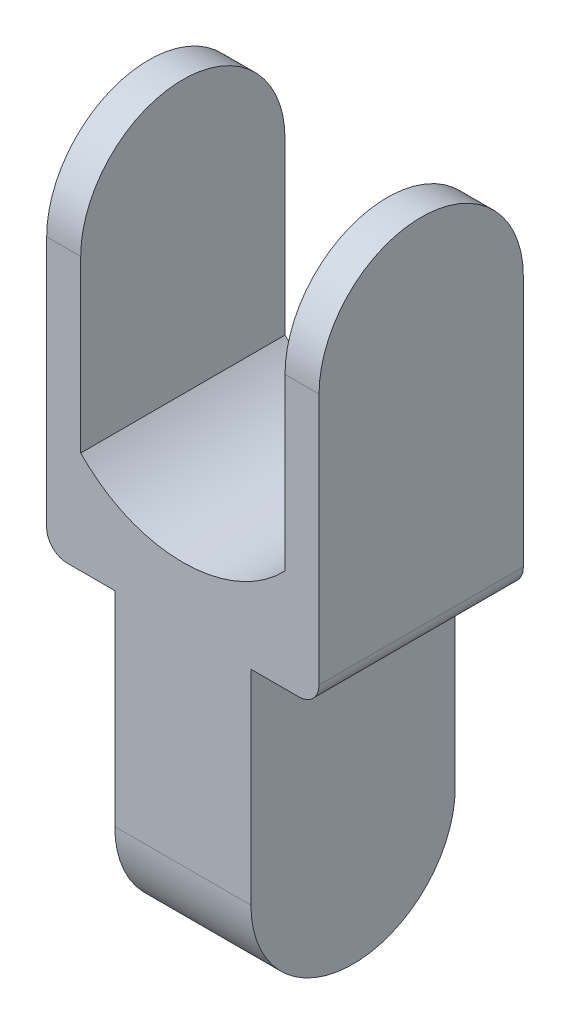
ISO-10303-21;
HEADER;
FILE_DESCRIPTION(('STEP AP214'),'2;1');
FILE_NAME('part.step','',(''),(''),'','','');
FILE_SCHEMA(('AUTOMOTIVE_DESIGN { 1 0 10303 214 1 1 1 1 }'));
ENDSEC;
DATA;
#1=APPLICATION_CONTEXT('core data for automotive mechanical design processes');
#2=APPLICATION_PROTOCOL_DEFINITION('international standard','automotive_design',2000,#1);
#3=PRODUCT_CONTEXT('',#1,'mechanical');
#4=PRODUCT('Part','Part','',(#3));
#5=PRODUCT_RELATED_PRODUCT_CATEGORY('part','',(#4));
#6=PRODUCT_DEFINITION_FORMATION('','',#4);
#7=PRODUCT_DEFINITION_CONTEXT('part definition',#1,'design');
#8=PRODUCT_DEFINITION('design','',#6,#7);
#9=PRODUCT_DEFINITION_SHAPE('','',#8);
#10=(LENGTH_UNIT() NAMED_UNIT(*) SI_UNIT(.MILLI.,.METRE.));
#11=(NAMED_UNIT(*) PLANE_ANGLE_UNIT() SI_UNIT($,.RADIAN.));
#12=(NAMED_UNIT(*) SI_UNIT($,.STERADIAN.) SOLID_ANGLE_UNIT());
#13=UNCERTAINTY_MEASURE_WITH_UNIT(LENGTH_MEASURE(1.E-05),#10,'distance_accuracy_value','');
#14=(GEOMETRIC_REPRESENTATION_CONTEXT(3) GLOBAL_UNCERTAINTY_ASSIGNED_CONTEXT((#13)) GLOBAL_UNIT_ASSIGNED_CONTEXT((#10,
#11,#12)) REPRESENTATION_CONTEXT('',''));
#15=CARTESIAN_POINT('',(0.,0.,0.));
#16=DIRECTION('',(0.,0.,1.));
#17=DIRECTION('',(1.,0.,0.));
#18=AXIS2_PLACEMENT_3D('',#15,#16,#17);
#19=CARTESIAN_POINT('',(-100.,300.,-150.));
#20=DIRECTION('',(0.,0.,-1.));
#21=DIRECTION('',(-1.,0.,0.));
#22=AXIS2_PLACEMENT_3D('',#19,#20,#21);
#23=PLANE('',#22);
#24=CARTESIAN_POINT('',(0.,593.524340848912,-150.));
#25=DIRECTION('',(0.,0.,-1.));
#26=DIRECTION('',(-1.,0.,0.));
#27=AXIS2_PLACEMENT_3D('',#24,#25,#26);
#28=CIRCLE('',#27,207.603555885044);
#29=CARTESIAN_POINT('',(150.,450.,-150.));
#30=VERTEX_POINT('',#29);
#31=CARTESIAN_POINT('',(-150.,450.,-150.));
#32=VERTEX_POINT('',#31);
#33=EDGE_CURVE('E136',#30,#32,#28,.T.);
#34=ORIENTED_EDGE('',*,*,#33,.F.);
#35=DIRECTION('',(0.,1.,0.));
#36=VECTOR('',#35,1.);
#37=CARTESIAN_POINT('',(150.,300.,-150.));
#38=LINE('',#37,#36);
#39=CARTESIAN_POINT('',(150.,700.,-150.));
#40=VERTEX_POINT('',#39);
#41=EDGE_CURVE('E149',#30,#40,#38,.T.);
#42=ORIENTED_EDGE('',*,*,#41,.T.);
#43=DIRECTION('',(1.,0.,0.));
#44=VECTOR('',#43,1.);
#45=CARTESIAN_POINT('',(0.,700.,-150.));
#46=LINE('',#45,#44);
#47=CARTESIAN_POINT('',(200.,700.,-150.));
#48=VERTEX_POINT('',#47);
#49=EDGE_CURVE('E188',#40,#48,#46,.T.);
#50=ORIENTED_EDGE('',*,*,#49,.T.);
#51=DIRECTION('',(0.,1.,0.));
#52=VECTOR('',#51,1.);
#53=CARTESIAN_POINT('',(200.,0.,-150.));
#54=LINE('',#53,#52);
#55=CARTESIAN_POINT('',(200.,330.,-150.));
#56=VERTEX_POINT('',#55);
#57=EDGE_CURVE('E186',#56,#48,#54,.T.);
#58=ORIENTED_EDGE('',*,*,#57,.F.);
#59=CARTESIAN_POINT('',(170.,330.,-150.));
#60=DIRECTION('',(0.,0.,-1.));
#61=DIRECTION('',(-1.,0.,0.));
#62=AXIS2_PLACEMENT_3D('',#59,#60,#61);
#63=CIRCLE('',#62,30.);
#64=CARTESIAN_POINT('',(170.,300.,-150.));
#65=VERTEX_POINT('',#64);
#66=EDGE_CURVE('E57',#56,#65,#63,.T.);
#67=ORIENTED_EDGE('',*,*,#66,.T.);
#68=DIRECTION('',(-1.,0.,0.));
#69=VECTOR('',#68,1.);
#70=CARTESIAN_POINT('',(0.,300.,-150.));
#71=LINE('',#70,#69);
#72=CARTESIAN_POINT('',(100.,300.,-150.));
#73=VERTEX_POINT('',#72);
#74=EDGE_CURVE('E184',#65,#73,#71,.T.);
#75=ORIENTED_EDGE('',*,*,#74,.T.);
#76=DIRECTION('',(0.,-1.,0.));
#77=VECTOR('',#76,1.);
#78=CARTESIAN_POINT('',(99.9999999999999,300.,-150.));
#79=LINE('',#78,#77);
#80=CARTESIAN_POINT('',(100.,0.,-150.));
#81=VERTEX_POINT('',#80);
#82=EDGE_CURVE('E196',#73,#81,#79,.T.);
#83=ORIENTED_EDGE('',*,*,#82,.T.);
#84=DIRECTION('',(1.,0.,0.));
#85=VECTOR('',#84,1.);
#86=CARTESIAN_POINT('',(-100.,0.,-150.));
#87=LINE('',#86,#85);
#88=CARTESIAN_POINT('',(-100.,0.,-150.));
#89=VERTEX_POINT('',#88);
#90=EDGE_CURVE('E181',#89,#81,#87,.T.);
#91=ORIENTED_EDGE('',*,*,#90,.F.);
#92=DIRECTION('',(0.,-1.,0.));
#93=VECTOR('',#92,1.);
#94=CARTESIAN_POINT('',(-100.,300.,-150.));
#95=LINE('',#94,#93);
#96=CARTESIAN_POINT('',(-100.,300.,-150.));
#97=VERTEX_POINT('',#96);
#98=EDGE_CURVE('E201',#97,#89,#95,.T.);
#99=ORIENTED_EDGE('',*,*,#98,.F.);
#100=CARTESIAN_POINT('',(-170.,300.,-150.));
#101=VERTEX_POINT('',#100);
#102=EDGE_CURVE('E183',#97,#101,#71,.T.);
#103=ORIENTED_EDGE('',*,*,#102,.T.);
#104=CARTESIAN_POINT('',(-170.,330.,-150.));
#105=DIRECTION('',(0.,0.,-1.));
#106=DIRECTION('',(-1.,0.,0.));
#107=AXIS2_PLACEMENT_3D('',#104,#105,#106);
#108=CIRCLE('',#107,30.);
#109=CARTESIAN_POINT('',(-200.,330.,-150.));
#110=VERTEX_POINT('',#109);
#111=EDGE_CURVE('E221',#101,#110,#108,.T.);
#112=ORIENTED_EDGE('',*,*,#111,.T.);
#113=DIRECTION('',(0.,1.,0.));
#114=VECTOR('',#113,1.);
#115=CARTESIAN_POINT('',(-200.,0.,-150.));
#116=LINE('',#115,#114);
#117=CARTESIAN_POINT('',(-200.,700.,-150.));
#118=VERTEX_POINT('',#117);
#119=EDGE_CURVE('E167',#110,#118,#116,.T.);
#120=ORIENTED_EDGE('',*,*,#119,.T.);
#121=CARTESIAN_POINT('',(-150.,700.,-150.));
#122=VERTEX_POINT('',#121);
#123=EDGE_CURVE('E172',#118,#122,#46,.T.);
#124=ORIENTED_EDGE('',*,*,#123,.T.);
#125=DIRECTION('',(0.,1.,0.));
#126=VECTOR('',#125,1.);
#127=CARTESIAN_POINT('',(-150.,300.,-150.));
#128=LINE('',#127,#126);
#129=EDGE_CURVE('E152',#32,#122,#128,.T.);
#130=ORIENTED_EDGE('',*,*,#129,.F.);
#131=EDGE_LOOP('',(#34,#42,#50,#58,#67,#75,#83,#91,#99,#103,#112,#120,#124,#130));
#132=FACE_BOUND('',#131,.T.);
#133=ADVANCED_FACE('F35',(#132),#23,.T.);
#134=CARTESIAN_POINT('',(-100.,300.,150.));
#135=DIRECTION('',(0.,0.,-1.));
#136=DIRECTION('',(-1.,0.,0.));
#137=AXIS2_PLACEMENT_3D('',#134,#135,#136);
#138=PLANE('',#137);
#139=DIRECTION('',(0.,1.,0.));
#140=VECTOR('',#139,1.);
#141=CARTESIAN_POINT('',(150.,300.,150.));
#142=LINE('',#141,#140);
#143=CARTESIAN_POINT('',(150.,450.,150.));
#144=VERTEX_POINT('',#143);
#145=CARTESIAN_POINT('',(150.,700.,150.));
#146=VERTEX_POINT('',#145);
#147=EDGE_CURVE('E158',#144,#146,#142,.T.);
#148=ORIENTED_EDGE('',*,*,#147,.F.);
#149=CARTESIAN_POINT('',(0.,593.524340848912,150.));
#150=DIRECTION('',(0.,0.,-1.));
#151=DIRECTION('',(-1.,0.,0.));
#152=AXIS2_PLACEMENT_3D('',#149,#150,#151);
#153=CIRCLE('',#152,207.603555885044);
#154=CARTESIAN_POINT('',(-150.,450.,150.));
#155=VERTEX_POINT('',#154);
#156=EDGE_CURVE('E139',#144,#155,#153,.T.);
#157=ORIENTED_EDGE('',*,*,#156,.T.);
#158=DIRECTION('',(0.,1.,0.));
#159=VECTOR('',#158,1.);
#160=CARTESIAN_POINT('',(-150.,300.,150.));
#161=LINE('',#160,#159);
#162=CARTESIAN_POINT('',(-150.,700.,150.));
#163=VERTEX_POINT('',#162);
#164=EDGE_CURVE('E143',#155,#163,#161,.T.);
#165=ORIENTED_EDGE('',*,*,#164,.T.);
#166=DIRECTION('',(1.,0.,0.));
#167=VECTOR('',#166,1.);
#168=CARTESIAN_POINT('',(0.,700.,150.));
#169=LINE('',#168,#167);
#170=CARTESIAN_POINT('',(-200.,700.,150.));
#171=VERTEX_POINT('',#170);
#172=EDGE_CURVE('E178',#171,#163,#169,.T.);
#173=ORIENTED_EDGE('',*,*,#172,.F.);
#174=DIRECTION('',(0.,1.,0.));
#175=VECTOR('',#174,1.);
#176=CARTESIAN_POINT('',(-200.,0.,150.));
#177=LINE('',#176,#175);
#178=CARTESIAN_POINT('',(-200.,330.,150.));
#179=VERTEX_POINT('',#178);
#180=EDGE_CURVE('E169',#179,#171,#177,.T.);
#181=ORIENTED_EDGE('',*,*,#180,.F.);
#182=CARTESIAN_POINT('',(-170.,330.,150.));
#183=DIRECTION('',(0.,0.,-1.));
#184=DIRECTION('',(-1.,0.,0.));
#185=AXIS2_PLACEMENT_3D('',#182,#183,#184);
#186=CIRCLE('',#185,30.);
#187=CARTESIAN_POINT('',(-170.,300.,150.));
#188=VERTEX_POINT('',#187);
#189=EDGE_CURVE('E225',#179,#188,#186,.F.);
#190=ORIENTED_EDGE('',*,*,#189,.T.);
#191=DIRECTION('',(-1.,0.,0.));
#192=VECTOR('',#191,1.);
#193=CARTESIAN_POINT('',(0.,300.,150.));
#194=LINE('',#193,#192);
#195=CARTESIAN_POINT('',(-100.,300.,150.));
#196=VERTEX_POINT('',#195);
#197=EDGE_CURVE('E171',#196,#188,#194,.T.);
#198=ORIENTED_EDGE('',*,*,#197,.F.);
#199=DIRECTION('',(0.,-1.,0.));
#200=VECTOR('',#199,1.);
#201=CARTESIAN_POINT('',(-100.,300.,150.));
#202=LINE('',#201,#200);
#203=CARTESIAN_POINT('',(-100.,0.,150.));
#204=VERTEX_POINT('',#203);
#205=EDGE_CURVE('E204',#196,#204,#202,.T.);
#206=ORIENTED_EDGE('',*,*,#205,.T.);
#207=DIRECTION('',(1.,0.,0.));
#208=VECTOR('',#207,1.);
#209=CARTESIAN_POINT('',(-100.,0.,150.));
#210=LINE('',#209,#208);
#211=CARTESIAN_POINT('',(100.,0.,150.));
#212=VERTEX_POINT('',#211);
#213=EDGE_CURVE('E194',#204,#212,#210,.T.);
#214=ORIENTED_EDGE('',*,*,#213,.T.);
#215=DIRECTION('',(0.,-1.,0.));
#216=VECTOR('',#215,1.);
#217=CARTESIAN_POINT('',(100.,300.,150.));
#218=LINE('',#217,#216);
#219=CARTESIAN_POINT('',(100.,300.,150.));
#220=VERTEX_POINT('',#219);
#221=EDGE_CURVE('E206',#220,#212,#218,.T.);
#222=ORIENTED_EDGE('',*,*,#221,.F.);
#223=CARTESIAN_POINT('',(170.,300.,150.));
#224=VERTEX_POINT('',#223);
#225=EDGE_CURVE('E173',#224,#220,#194,.T.);
#226=ORIENTED_EDGE('',*,*,#225,.F.);
#227=CARTESIAN_POINT('',(170.,330.,150.));
#228=DIRECTION('',(0.,0.,-1.));
#229=DIRECTION('',(-1.,0.,0.));
#230=AXIS2_PLACEMENT_3D('',#227,#228,#229);
#231=CIRCLE('',#230,30.);
#232=CARTESIAN_POINT('',(200.,330.,150.));
#233=VERTEX_POINT('',#232);
#234=EDGE_CURVE('E11',#224,#233,#231,.F.);
#235=ORIENTED_EDGE('',*,*,#234,.T.);
#236=DIRECTION('',(0.,1.,0.));
#237=VECTOR('',#236,1.);
#238=CARTESIAN_POINT('',(200.,0.,150.));
#239=LINE('',#238,#237);
#240=CARTESIAN_POINT('',(200.,700.,150.));
#241=VERTEX_POINT('',#240);
#242=EDGE_CURVE('E175',#233,#241,#239,.T.);
#243=ORIENTED_EDGE('',*,*,#242,.T.);
#244=EDGE_CURVE('E177',#146,#241,#169,.T.);
#245=ORIENTED_EDGE('',*,*,#244,.F.);
#246=EDGE_LOOP('',(#148,#157,#165,#173,#181,#190,#198,#206,#214,#222,#226,#235,#243,#245));
#247=FACE_BOUND('',#246,.T.);
#248=ADVANCED_FACE('F242',(#247),#138,.F.);
#249=CARTESIAN_POINT('',(200.,700.,0.));
#250=DIRECTION('',(-1.,0.,0.));
#251=DIRECTION('',(0.,0.,1.));
#252=AXIS2_PLACEMENT_3D('',#249,#250,#251);
#253=CYLINDRICAL_SURFACE('',#252,150.);
#254=CARTESIAN_POINT('',(150.,700.,0.));
#255=DIRECTION('',(-1.,0.,0.));
#256=DIRECTION('',(0.,-1.,0.));
#257=AXIS2_PLACEMENT_3D('',#254,#255,#256);
#258=CIRCLE('',#257,150.);
#259=EDGE_CURVE('E156',#146,#40,#258,.T.);
#260=ORIENTED_EDGE('',*,*,#259,.F.);
#261=ORIENTED_EDGE('',*,*,#244,.T.);
#262=CARTESIAN_POINT('',(200.,700.,0.));
#263=DIRECTION('',(1.,0.,0.));
#264=DIRECTION('',(0.,0.,-1.));
#265=AXIS2_PLACEMENT_3D('',#262,#263,#264);
#266=CIRCLE('',#265,150.);
#267=EDGE_CURVE('E161',#48,#241,#266,.T.);
#268=ORIENTED_EDGE('',*,*,#267,.F.);
#269=ORIENTED_EDGE('',*,*,#49,.F.);
#270=EDGE_LOOP('',(#260,#261,#268,#269));
#271=FACE_BOUND('',#270,.T.);
#272=ADVANCED_FACE('F239',(#271),#253,.T.);
#273=CARTESIAN_POINT('',(100.,0.,0.));
#274=DIRECTION('',(-1.,0.,0.));
#275=DIRECTION('',(0.,0.,1.));
#276=AXIS2_PLACEMENT_3D('',#273,#274,#275);
#277=CYLINDRICAL_SURFACE('',#276,150.);
#278=CARTESIAN_POINT('',(100.,0.,0.));
#279=DIRECTION('',(1.,0.,0.));
#280=DIRECTION('',(0.,0.,-1.));
#281=AXIS2_PLACEMENT_3D('',#278,#279,#280);
#282=CIRCLE('',#281,150.);
#283=EDGE_CURVE('E209',#212,#81,#282,.T.);
#284=ORIENTED_EDGE('',*,*,#283,.F.);
#285=ORIENTED_EDGE('',*,*,#213,.F.);
#286=CARTESIAN_POINT('',(-100.,0.,0.));
#287=DIRECTION('',(1.,0.,0.));
#288=DIRECTION('',(0.,0.,-1.));
#289=AXIS2_PLACEMENT_3D('',#286,#287,#288);
#290=CIRCLE('',#289,150.);
#291=EDGE_CURVE('E203',#204,#89,#290,.T.);
#292=ORIENTED_EDGE('',*,*,#291,.T.);
#293=ORIENTED_EDGE('',*,*,#90,.T.);
#294=EDGE_LOOP('',(#284,#285,#292,#293));
#295=FACE_BOUND('',#294,.T.);
#296=ADVANCED_FACE('F265',(#295),#277,.T.);
#297=CARTESIAN_POINT('',(100.,0.,0.));
#298=DIRECTION('',(1.,0.,0.));
#299=DIRECTION('',(0.,0.,-1.));
#300=AXIS2_PLACEMENT_3D('',#297,#298,#299);
#301=PLANE('',#300);
#302=ORIENTED_EDGE('',*,*,#283,.T.);
#303=ORIENTED_EDGE('',*,*,#82,.F.);
#304=DIRECTION('',(0.,0.,1.));
#305=VECTOR('',#304,1.);
#306=CARTESIAN_POINT('',(99.9999999999999,300.,-150.));
#307=LINE('',#306,#305);
#308=EDGE_CURVE('E190',#73,#220,#307,.T.);
#309=ORIENTED_EDGE('',*,*,#308,.T.);
#310=ORIENTED_EDGE('',*,*,#221,.T.);
#311=EDGE_LOOP('',(#302,#303,#309,#310));
#312=FACE_BOUND('',#311,.T.);
#313=ADVANCED_FACE('F261',(#312),#301,.T.);
#314=CARTESIAN_POINT('',(-100.,0.,0.));
#315=DIRECTION('',(1.,0.,0.));
#316=DIRECTION('',(0.,0.,-1.));
#317=AXIS2_PLACEMENT_3D('',#314,#315,#316);
#318=PLANE('',#317);
#319=ORIENTED_EDGE('',*,*,#291,.F.);
#320=ORIENTED_EDGE('',*,*,#205,.F.);
#321=DIRECTION('',(0.,0.,1.));
#322=VECTOR('',#321,1.);
#323=CARTESIAN_POINT('',(-100.,300.,-150.));
#324=LINE('',#323,#322);
#325=EDGE_CURVE('E193',#97,#196,#324,.T.);
#326=ORIENTED_EDGE('',*,*,#325,.F.);
#327=ORIENTED_EDGE('',*,*,#98,.T.);
#328=EDGE_LOOP('',(#319,#320,#326,#327));
#329=FACE_BOUND('',#328,.T.);
#330=ADVANCED_FACE('F264',(#329),#318,.F.);
#331=CARTESIAN_POINT('',(0.,300.,150.));
#332=DIRECTION('',(0.,-1.,0.));
#333=DIRECTION('',(1.,0.,0.));
#334=AXIS2_PLACEMENT_3D('',#331,#332,#333);
#335=PLANE('',#334);
#336=ORIENTED_EDGE('',*,*,#74,.F.);
#337=DIRECTION('',(0.,0.,-1.));
#338=VECTOR('',#337,1.);
#339=CARTESIAN_POINT('',(170.,300.,150.));
#340=LINE('',#339,#338);
#341=EDGE_CURVE('E43',#65,#224,#340,.F.);
#342=ORIENTED_EDGE('',*,*,#341,.T.);
#343=ORIENTED_EDGE('',*,*,#225,.T.);
#344=ORIENTED_EDGE('',*,*,#308,.F.);
#345=EDGE_LOOP('',(#336,#342,#343,#344));
#346=FACE_BOUND('',#345,.T.);
#347=ADVANCED_FACE('F269',(#346),#335,.T.);
#348=CARTESIAN_POINT('',(-200.,0.,150.));
#349=DIRECTION('',(-1.,0.,0.));
#350=DIRECTION('',(0.,0.,1.));
#351=AXIS2_PLACEMENT_3D('',#348,#349,#350);
#352=PLANE('',#351);
#353=ORIENTED_EDGE('',*,*,#119,.F.);
#354=DIRECTION('',(0.,0.,-1.));
#355=VECTOR('',#354,1.);
#356=CARTESIAN_POINT('',(-200.,330.,150.));
#357=LINE('',#356,#355);
#358=EDGE_CURVE('E223',#110,#179,#357,.F.);
#359=ORIENTED_EDGE('',*,*,#358,.T.);
#360=ORIENTED_EDGE('',*,*,#180,.T.);
#361=CARTESIAN_POINT('',(-200.,700.,0.));
#362=DIRECTION('',(1.,0.,0.));
#363=DIRECTION('',(0.,0.,-1.));
#364=AXIS2_PLACEMENT_3D('',#361,#362,#363);
#365=CIRCLE('',#364,150.);
#366=EDGE_CURVE('E157',#118,#171,#365,.T.);
#367=ORIENTED_EDGE('',*,*,#366,.F.);
#368=EDGE_LOOP('',(#353,#359,#360,#367));
#369=FACE_BOUND('',#368,.T.);
#370=ADVANCED_FACE('F291',(#369),#352,.T.);
#371=ORIENTED_EDGE('',*,*,#197,.T.);
#372=DIRECTION('',(0.,0.,-1.));
#373=VECTOR('',#372,1.);
#374=CARTESIAN_POINT('',(-170.,300.,150.));
#375=LINE('',#374,#373);
#376=EDGE_CURVE('E218',#188,#101,#375,.T.);
#377=ORIENTED_EDGE('',*,*,#376,.T.);
#378=ORIENTED_EDGE('',*,*,#102,.F.);
#379=ORIENTED_EDGE('',*,*,#325,.T.);
#380=EDGE_LOOP('',(#371,#377,#378,#379));
#381=FACE_BOUND('',#380,.T.);
#382=ADVANCED_FACE('F293',(#381),#335,.T.);
#383=CARTESIAN_POINT('',(200.,0.,150.));
#384=DIRECTION('',(-1.,0.,0.));
#385=DIRECTION('',(0.,0.,1.));
#386=AXIS2_PLACEMENT_3D('',#383,#384,#385);
#387=PLANE('',#386);
#388=ORIENTED_EDGE('',*,*,#242,.F.);
#389=DIRECTION('',(0.,0.,-1.));
#390=VECTOR('',#389,1.);
#391=CARTESIAN_POINT('',(200.,330.,-150.));
#392=LINE('',#391,#390);
#393=EDGE_CURVE('E227',#233,#56,#392,.T.);
#394=ORIENTED_EDGE('',*,*,#393,.T.);
#395=ORIENTED_EDGE('',*,*,#57,.T.);
#396=ORIENTED_EDGE('',*,*,#267,.T.);
#397=EDGE_LOOP('',(#388,#394,#395,#396));
#398=FACE_BOUND('',#397,.T.);
#399=ADVANCED_FACE('F233',(#398),#387,.F.);
#400=ORIENTED_EDGE('',*,*,#172,.T.);
#401=CARTESIAN_POINT('',(-150.,700.,0.));
#402=DIRECTION('',(-1.,0.,0.));
#403=DIRECTION('',(0.,-1.,0.));
#404=AXIS2_PLACEMENT_3D('',#401,#402,#403);
#405=CIRCLE('',#404,150.);
#406=EDGE_CURVE('E212',#163,#122,#405,.T.);
#407=ORIENTED_EDGE('',*,*,#406,.T.);
#408=ORIENTED_EDGE('',*,*,#123,.F.);
#409=ORIENTED_EDGE('',*,*,#366,.T.);
#410=EDGE_LOOP('',(#400,#407,#408,#409));
#411=FACE_BOUND('',#410,.T.);
#412=ADVANCED_FACE('F277',(#411),#253,.T.);
#413=CARTESIAN_POINT('',(150.,1250.,-200.));
#414=DIRECTION('',(-1.,0.,0.));
#415=DIRECTION('',(0.,-1.,0.));
#416=AXIS2_PLACEMENT_3D('',#413,#414,#415);
#417=PLANE('',#416);
#418=DIRECTION('',(0.,0.,1.));
#419=VECTOR('',#418,1.);
#420=CARTESIAN_POINT('',(150.,450.,-200.));
#421=LINE('',#420,#419);
#422=EDGE_CURVE('E133',#30,#144,#421,.T.);
#423=ORIENTED_EDGE('',*,*,#422,.T.);
#424=ORIENTED_EDGE('',*,*,#147,.T.);
#425=ORIENTED_EDGE('',*,*,#259,.T.);
#426=ORIENTED_EDGE('',*,*,#41,.F.);
#427=EDGE_LOOP('',(#423,#424,#425,#426));
#428=FACE_BOUND('',#427,.T.);
#429=ADVANCED_FACE('F154',(#428),#417,.T.);
#430=CARTESIAN_POINT('',(-150.,1250.,-200.));
#431=DIRECTION('',(-1.,0.,0.));
#432=DIRECTION('',(0.,-1.,0.));
#433=AXIS2_PLACEMENT_3D('',#430,#431,#432);
#434=PLANE('',#433);
#435=ORIENTED_EDGE('',*,*,#129,.T.);
#436=ORIENTED_EDGE('',*,*,#406,.F.);
#437=ORIENTED_EDGE('',*,*,#164,.F.);
#438=DIRECTION('',(0.,0.,1.));
#439=VECTOR('',#438,1.);
#440=CARTESIAN_POINT('',(-150.,450.,-200.));
#441=LINE('',#440,#439);
#442=EDGE_CURVE('E144',#32,#155,#441,.T.);
#443=ORIENTED_EDGE('',*,*,#442,.F.);
#444=EDGE_LOOP('',(#435,#436,#437,#443));
#445=FACE_BOUND('',#444,.T.);
#446=ADVANCED_FACE('F251',(#445),#434,.F.);
#447=CARTESIAN_POINT('',(-170.,330.,150.));
#448=DIRECTION('',(0.,0.,-1.));
#449=DIRECTION('',(-1.,0.,0.));
#450=AXIS2_PLACEMENT_3D('',#447,#448,#449);
#451=CYLINDRICAL_SURFACE('',#450,30.);
#452=ORIENTED_EDGE('',*,*,#189,.F.);
#453=ORIENTED_EDGE('',*,*,#358,.F.);
#454=ORIENTED_EDGE('',*,*,#111,.F.);
#455=ORIENTED_EDGE('',*,*,#376,.F.);
#456=EDGE_LOOP('',(#452,#453,#454,#455));
#457=FACE_BOUND('',#456,.T.);
#458=ADVANCED_FACE('F245',(#457),#451,.T.);
#459=CARTESIAN_POINT('',(170.,330.,150.));
#460=DIRECTION('',(0.,0.,1.));
#461=DIRECTION('',(1.,0.,0.));
#462=AXIS2_PLACEMENT_3D('',#459,#460,#461);
#463=CYLINDRICAL_SURFACE('',#462,30.);
#464=ORIENTED_EDGE('',*,*,#234,.F.);
#465=ORIENTED_EDGE('',*,*,#341,.F.);
#466=ORIENTED_EDGE('',*,*,#66,.F.);
#467=ORIENTED_EDGE('',*,*,#393,.F.);
#468=EDGE_LOOP('',(#464,#465,#466,#467));
#469=FACE_BOUND('',#468,.T.);
#470=ADVANCED_FACE('F37',(#469),#463,.T.);
#471=CARTESIAN_POINT('',(0.,593.524340848912,-213.5));
#472=DIRECTION('',(0.,0.,1.));
#473=DIRECTION('',(1.,0.,0.));
#474=AXIS2_PLACEMENT_3D('',#471,#472,#473);
#475=CYLINDRICAL_SURFACE('',#474,207.603555885044);
#476=ORIENTED_EDGE('',*,*,#33,.T.);
#477=ORIENTED_EDGE('',*,*,#442,.T.);
#478=ORIENTED_EDGE('',*,*,#156,.F.);
#479=ORIENTED_EDGE('',*,*,#422,.F.);
#480=EDGE_LOOP('',(#476,#477,#478,#479));
#481=FACE_BOUND('',#480,.T.);
#482=ADVANCED_FACE('F135',(#481),#475,.F.);
#483=CLOSED_SHELL('',(#133,#248,#272,#296,#313,#330,#347,#370,#382,#399,#412,#429,#446,#458,
#470,#482));
#484=MANIFOLD_SOLID_BREP('B2',#483);
#485=ADVANCED_BREP_SHAPE_REPRESENTATION('',(#18,#484),#14);
#486=SHAPE_DEFINITION_REPRESENTATION(#9,#485);
ENDSEC;
END-ISO-10303-21;
